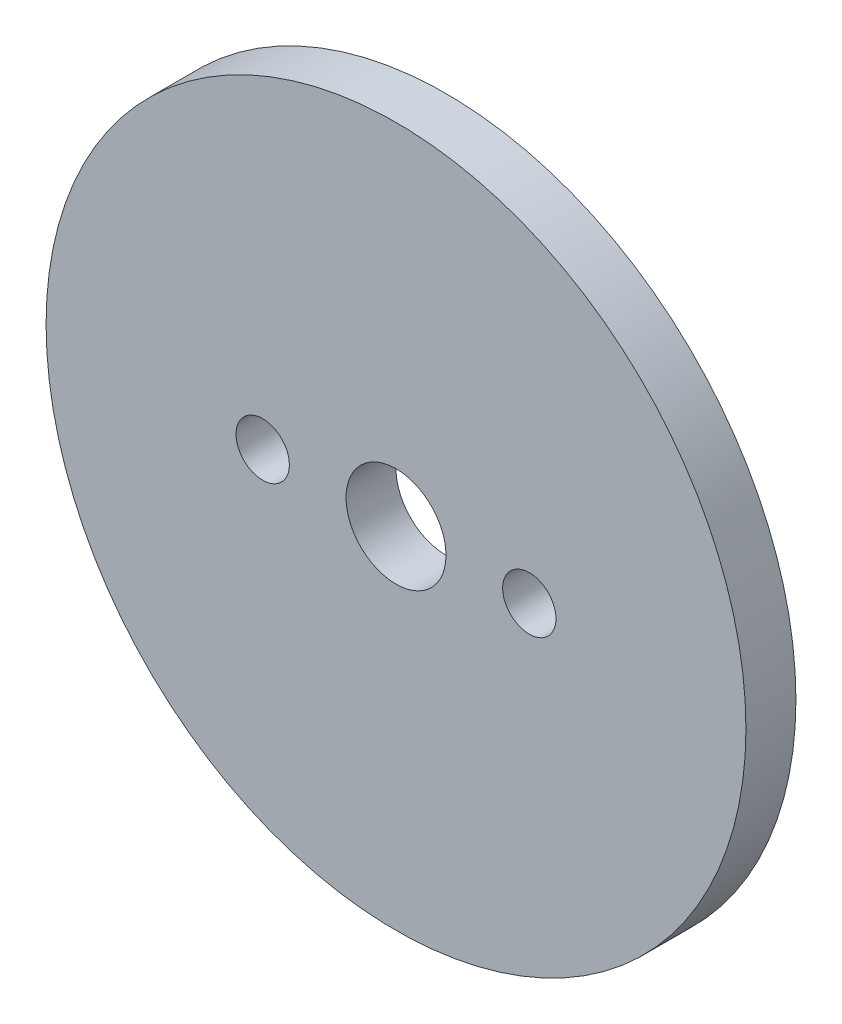
ISO-10303-21;
HEADER;
FILE_DESCRIPTION(('STEP AP214'),'2;1');
FILE_NAME('part.step','',(''),(''),'','','');
FILE_SCHEMA(('AUTOMOTIVE_DESIGN { 1 0 10303 214 1 1 1 1 }'));
ENDSEC;
DATA;
#1=APPLICATION_CONTEXT('core data for automotive mechanical design processes');
#2=APPLICATION_PROTOCOL_DEFINITION('international standard','automotive_design',2000,#1);
#3=PRODUCT_CONTEXT('',#1,'mechanical');
#4=PRODUCT('Part','Part','',(#3));
#5=PRODUCT_RELATED_PRODUCT_CATEGORY('part','',(#4));
#6=PRODUCT_DEFINITION_FORMATION('','',#4);
#7=PRODUCT_DEFINITION_CONTEXT('part definition',#1,'design');
#8=PRODUCT_DEFINITION('design','',#6,#7);
#9=PRODUCT_DEFINITION_SHAPE('','',#8);
#10=(LENGTH_UNIT() NAMED_UNIT(*) SI_UNIT(.MILLI.,.METRE.));
#11=(NAMED_UNIT(*) PLANE_ANGLE_UNIT() SI_UNIT($,.RADIAN.));
#12=(NAMED_UNIT(*) SI_UNIT($,.STERADIAN.) SOLID_ANGLE_UNIT());
#13=UNCERTAINTY_MEASURE_WITH_UNIT(LENGTH_MEASURE(1.E-05),#10,'distance_accuracy_value','');
#14=(GEOMETRIC_REPRESENTATION_CONTEXT(3) GLOBAL_UNCERTAINTY_ASSIGNED_CONTEXT((#13)) GLOBAL_UNIT_ASSIGNED_CONTEXT((#10,
#11,#12)) REPRESENTATION_CONTEXT('',''));
#15=CARTESIAN_POINT('',(0.,0.,0.));
#16=DIRECTION('',(0.,0.,1.));
#17=DIRECTION('',(1.,0.,0.));
#18=AXIS2_PLACEMENT_3D('',#15,#16,#17);
#19=CARTESIAN_POINT('',(0.,0.,1.5));
#20=DIRECTION('',(0.,0.,1.));
#21=DIRECTION('',(1.,0.,0.));
#22=AXIS2_PLACEMENT_3D('',#19,#20,#21);
#23=PLANE('',#22);
#24=CARTESIAN_POINT('',(-8.,0.,1.5));
#25=DIRECTION('',(0.,0.,1.));
#26=DIRECTION('',(1.,0.,0.));
#27=AXIS2_PLACEMENT_3D('',#24,#25,#26);
#28=CIRCLE('',#27,1.6);
#29=CARTESIAN_POINT('',(-6.4,0.,1.5));
#30=VERTEX_POINT('',#29);
#31=EDGE_CURVE('E47',#30,#30,#28,.T.);
#32=ORIENTED_EDGE('',*,*,#31,.F.);
#33=EDGE_LOOP('',(#32));
#34=FACE_BOUND('',#33,.T.);
#35=CARTESIAN_POINT('',(0.,0.,1.5));
#36=DIRECTION('',(0.,0.,1.));
#37=DIRECTION('',(1.,0.,0.));
#38=AXIS2_PLACEMENT_3D('',#35,#36,#37);
#39=CIRCLE('',#38,21.);
#40=CARTESIAN_POINT('',(21.,0.,1.5));
#41=VERTEX_POINT('',#40);
#42=EDGE_CURVE('E10',#41,#41,#39,.T.);
#43=ORIENTED_EDGE('',*,*,#42,.T.);
#44=EDGE_LOOP('',(#43));
#45=FACE_BOUND('',#44,.T.);
#46=CARTESIAN_POINT('',(0.,0.,1.5));
#47=DIRECTION('',(0.,0.,1.));
#48=DIRECTION('',(1.,0.,0.));
#49=AXIS2_PLACEMENT_3D('',#46,#47,#48);
#50=CIRCLE('',#49,3.);
#51=CARTESIAN_POINT('',(3.,0.,1.5));
#52=VERTEX_POINT('',#51);
#53=EDGE_CURVE('E42',#52,#52,#50,.T.);
#54=ORIENTED_EDGE('',*,*,#53,.F.);
#55=EDGE_LOOP('',(#54));
#56=FACE_BOUND('',#55,.T.);
#57=CARTESIAN_POINT('',(8.,0.,1.5));
#58=DIRECTION('',(0.,0.,1.));
#59=DIRECTION('',(1.,0.,0.));
#60=AXIS2_PLACEMENT_3D('',#57,#58,#59);
#61=CIRCLE('',#60,1.6);
#62=CARTESIAN_POINT('',(9.6,0.,1.5));
#63=VERTEX_POINT('',#62);
#64=EDGE_CURVE('E53',#63,#63,#61,.T.);
#65=ORIENTED_EDGE('',*,*,#64,.F.);
#66=EDGE_LOOP('',(#65));
#67=FACE_BOUND('',#66,.T.);
#68=ADVANCED_FACE('F31',(#34,#45,#56,#67),#23,.T.);
#69=CARTESIAN_POINT('',(0.,0.,-1.5));
#70=DIRECTION('',(0.,0.,1.));
#71=DIRECTION('',(1.,0.,0.));
#72=AXIS2_PLACEMENT_3D('',#69,#70,#71);
#73=PLANE('',#72);
#74=CARTESIAN_POINT('',(0.,0.,-1.5));
#75=DIRECTION('',(0.,0.,1.));
#76=DIRECTION('',(1.,0.,0.));
#77=AXIS2_PLACEMENT_3D('',#74,#75,#76);
#78=CIRCLE('',#77,21.);
#79=CARTESIAN_POINT('',(21.,0.,-1.5));
#80=VERTEX_POINT('',#79);
#81=EDGE_CURVE('E35',#80,#80,#78,.T.);
#82=ORIENTED_EDGE('',*,*,#81,.F.);
#83=EDGE_LOOP('',(#82));
#84=FACE_BOUND('',#83,.T.);
#85=CARTESIAN_POINT('',(0.,0.,-1.5));
#86=DIRECTION('',(0.,0.,1.));
#87=DIRECTION('',(1.,0.,0.));
#88=AXIS2_PLACEMENT_3D('',#85,#86,#87);
#89=CIRCLE('',#88,3.);
#90=CARTESIAN_POINT('',(3.,0.,-1.5));
#91=VERTEX_POINT('',#90);
#92=EDGE_CURVE('E44',#91,#91,#89,.T.);
#93=ORIENTED_EDGE('',*,*,#92,.T.);
#94=EDGE_LOOP('',(#93));
#95=FACE_BOUND('',#94,.T.);
#96=CARTESIAN_POINT('',(-8.,0.,-1.5));
#97=DIRECTION('',(0.,0.,1.));
#98=DIRECTION('',(1.,0.,0.));
#99=AXIS2_PLACEMENT_3D('',#96,#97,#98);
#100=CIRCLE('',#99,1.6);
#101=CARTESIAN_POINT('',(-6.4,0.,-1.5));
#102=VERTEX_POINT('',#101);
#103=EDGE_CURVE('E50',#102,#102,#100,.T.);
#104=ORIENTED_EDGE('',*,*,#103,.T.);
#105=EDGE_LOOP('',(#104));
#106=FACE_BOUND('',#105,.T.);
#107=CARTESIAN_POINT('',(8.,0.,-1.5));
#108=DIRECTION('',(0.,0.,1.));
#109=DIRECTION('',(1.,0.,0.));
#110=AXIS2_PLACEMENT_3D('',#107,#108,#109);
#111=CIRCLE('',#110,1.6);
#112=CARTESIAN_POINT('',(9.6,0.,-1.5));
#113=VERTEX_POINT('',#112);
#114=EDGE_CURVE('E56',#113,#113,#111,.T.);
#115=ORIENTED_EDGE('',*,*,#114,.T.);
#116=EDGE_LOOP('',(#115));
#117=FACE_BOUND('',#116,.T.);
#118=ADVANCED_FACE('F66',(#84,#95,#106,#117),#73,.F.);
#119=CARTESIAN_POINT('',(0.,0.,1.5));
#120=DIRECTION('',(0.,0.,-1.));
#121=DIRECTION('',(-1.,0.,0.));
#122=AXIS2_PLACEMENT_3D('',#119,#120,#121);
#123=CYLINDRICAL_SURFACE('',#122,21.);
#124=ORIENTED_EDGE('',*,*,#42,.F.);
#125=EDGE_LOOP('',(#124));
#126=FACE_BOUND('',#125,.T.);
#127=ORIENTED_EDGE('',*,*,#81,.T.);
#128=EDGE_LOOP('',(#127));
#129=FACE_BOUND('',#128,.T.);
#130=ADVANCED_FACE('F33',(#126,#129),#123,.T.);
#131=CARTESIAN_POINT('',(0.,0.,1.5));
#132=DIRECTION('',(0.,0.,-1.));
#133=DIRECTION('',(-1.,0.,0.));
#134=AXIS2_PLACEMENT_3D('',#131,#132,#133);
#135=CYLINDRICAL_SURFACE('',#134,3.);
#136=ORIENTED_EDGE('',*,*,#53,.T.);
#137=EDGE_LOOP('',(#136));
#138=FACE_BOUND('',#137,.T.);
#139=ORIENTED_EDGE('',*,*,#92,.F.);
#140=EDGE_LOOP('',(#139));
#141=FACE_BOUND('',#140,.T.);
#142=ADVANCED_FACE('F75',(#138,#141),#135,.F.);
#143=CARTESIAN_POINT('',(-8.,0.,1.5));
#144=DIRECTION('',(0.,0.,-1.));
#145=DIRECTION('',(-1.,0.,0.));
#146=AXIS2_PLACEMENT_3D('',#143,#144,#145);
#147=CYLINDRICAL_SURFACE('',#146,1.6);
#148=ORIENTED_EDGE('',*,*,#31,.T.);
#149=EDGE_LOOP('',(#148));
#150=FACE_BOUND('',#149,.T.);
#151=ORIENTED_EDGE('',*,*,#103,.F.);
#152=EDGE_LOOP('',(#151));
#153=FACE_BOUND('',#152,.T.);
#154=ADVANCED_FACE('F78',(#150,#153),#147,.F.);
#155=CARTESIAN_POINT('',(8.,0.,1.5));
#156=DIRECTION('',(0.,0.,-1.));
#157=DIRECTION('',(-1.,0.,0.));
#158=AXIS2_PLACEMENT_3D('',#155,#156,#157);
#159=CYLINDRICAL_SURFACE('',#158,1.6);
#160=ORIENTED_EDGE('',*,*,#64,.T.);
#161=EDGE_LOOP('',(#160));
#162=FACE_BOUND('',#161,.T.);
#163=ORIENTED_EDGE('',*,*,#114,.F.);
#164=EDGE_LOOP('',(#163));
#165=FACE_BOUND('',#164,.T.);
#166=ADVANCED_FACE('F62',(#162,#165),#159,.F.);
#167=CLOSED_SHELL('',(#68,#118,#130,#142,#154,#166));
#168=MANIFOLD_SOLID_BREP('B2',#167);
#169=ADVANCED_BREP_SHAPE_REPRESENTATION('',(#18,#168),#14);
#170=SHAPE_DEFINITION_REPRESENTATION(#9,#169);
ENDSEC;
END-ISO-10303-21;
